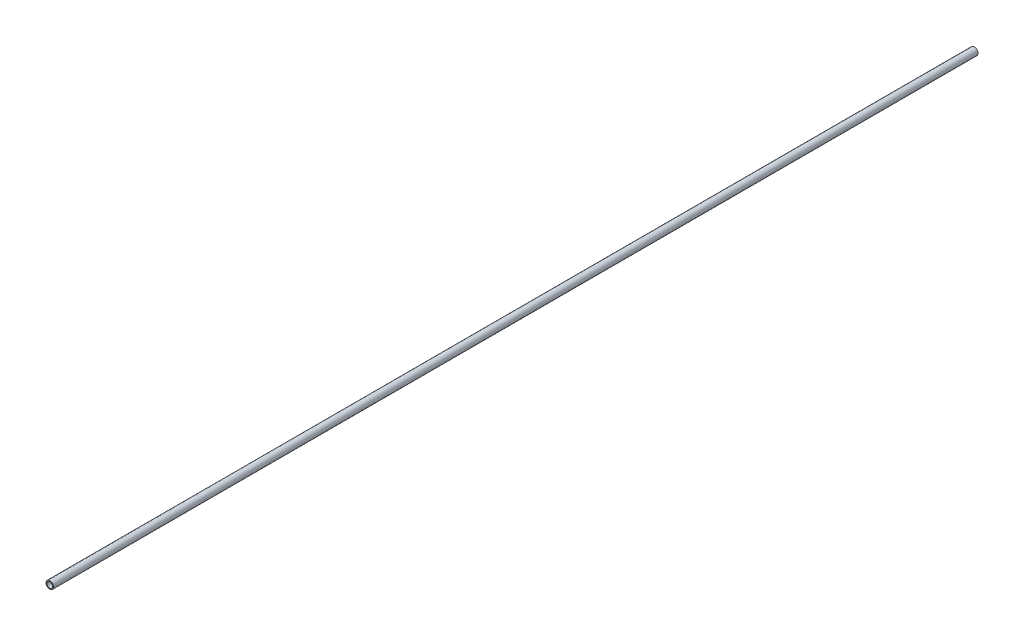
ISO-10303-21;
HEADER;
FILE_DESCRIPTION(('STEP AP214'),'2;1');
FILE_NAME('part.step','',(''),(''),'','','');
FILE_SCHEMA(('AUTOMOTIVE_DESIGN { 1 0 10303 214 1 1 1 1 }'));
ENDSEC;
DATA;
#1=APPLICATION_CONTEXT('core data for automotive mechanical design processes');
#2=APPLICATION_PROTOCOL_DEFINITION('international standard','automotive_design',2000,#1);
#3=PRODUCT_CONTEXT('',#1,'mechanical');
#4=PRODUCT('Part','Part','',(#3));
#5=PRODUCT_RELATED_PRODUCT_CATEGORY('part','',(#4));
#6=PRODUCT_DEFINITION_FORMATION('','',#4);
#7=PRODUCT_DEFINITION_CONTEXT('part definition',#1,'design');
#8=PRODUCT_DEFINITION('design','',#6,#7);
#9=PRODUCT_DEFINITION_SHAPE('','',#8);
#10=(LENGTH_UNIT() NAMED_UNIT(*) SI_UNIT(.MILLI.,.METRE.));
#11=(NAMED_UNIT(*) PLANE_ANGLE_UNIT() SI_UNIT($,.RADIAN.));
#12=(NAMED_UNIT(*) SI_UNIT($,.STERADIAN.) SOLID_ANGLE_UNIT());
#13=UNCERTAINTY_MEASURE_WITH_UNIT(LENGTH_MEASURE(1.E-05),#10,'distance_accuracy_value','');
#14=(GEOMETRIC_REPRESENTATION_CONTEXT(3) GLOBAL_UNCERTAINTY_ASSIGNED_CONTEXT((#13)) GLOBAL_UNIT_ASSIGNED_CONTEXT((#10,
#11,#12)) REPRESENTATION_CONTEXT('',''));
#15=CARTESIAN_POINT('',(0.,0.,0.));
#16=DIRECTION('',(0.,0.,1.));
#17=DIRECTION('',(1.,0.,0.));
#18=AXIS2_PLACEMENT_3D('',#15,#16,#17);
#19=CARTESIAN_POINT('',(0.,0.,990.6));
#20=DIRECTION('',(0.,0.,1.));
#21=DIRECTION('',(1.,0.,0.));
#22=AXIS2_PLACEMENT_3D('',#19,#20,#21);
#23=PLANE('',#22);
#24=CARTESIAN_POINT('',(0.,0.,990.6));
#25=DIRECTION('',(0.,0.,1.));
#26=DIRECTION('',(1.,0.,0.));
#27=AXIS2_PLACEMENT_3D('',#24,#25,#26);
#28=CIRCLE('',#27,4.);
#29=CARTESIAN_POINT('',(-4.,0.,990.6));
#30=VERTEX_POINT('',#29);
#31=EDGE_CURVE('E10',#30,#30,#28,.T.);
#32=ORIENTED_EDGE('',*,*,#31,.T.);
#33=EDGE_LOOP('',(#32));
#34=FACE_BOUND('',#33,.T.);
#35=CARTESIAN_POINT('',(0.,0.,990.6));
#36=DIRECTION('',(0.,0.,1.));
#37=DIRECTION('',(1.,0.,0.));
#38=AXIS2_PLACEMENT_3D('',#35,#36,#37);
#39=CIRCLE('',#38,3.);
#40=CARTESIAN_POINT('',(-3.,0.,990.6));
#41=VERTEX_POINT('',#40);
#42=EDGE_CURVE('E52',#41,#41,#39,.T.);
#43=ORIENTED_EDGE('',*,*,#42,.F.);
#44=EDGE_LOOP('',(#43));
#45=FACE_BOUND('',#44,.T.);
#46=ADVANCED_FACE('F39',(#34,#45),#23,.T.);
#47=CARTESIAN_POINT('',(0.,0.,0.));
#48=DIRECTION('',(0.,0.,1.));
#49=DIRECTION('',(1.,0.,0.));
#50=AXIS2_PLACEMENT_3D('',#47,#48,#49);
#51=PLANE('',#50);
#52=CARTESIAN_POINT('',(0.,0.,0.));
#53=DIRECTION('',(0.,0.,1.));
#54=DIRECTION('',(1.,0.,0.));
#55=AXIS2_PLACEMENT_3D('',#52,#53,#54);
#56=CIRCLE('',#55,4.);
#57=CARTESIAN_POINT('',(-4.,0.,0.));
#58=VERTEX_POINT('',#57);
#59=EDGE_CURVE('E43',#58,#58,#56,.T.);
#60=ORIENTED_EDGE('',*,*,#59,.F.);
#61=EDGE_LOOP('',(#60));
#62=FACE_BOUND('',#61,.T.);
#63=CARTESIAN_POINT('',(0.,0.,0.));
#64=DIRECTION('',(0.,0.,1.));
#65=DIRECTION('',(1.,0.,0.));
#66=AXIS2_PLACEMENT_3D('',#63,#64,#65);
#67=CIRCLE('',#66,3.);
#68=CARTESIAN_POINT('',(-3.,0.,0.));
#69=VERTEX_POINT('',#68);
#70=EDGE_CURVE('E54',#69,#69,#67,.T.);
#71=ORIENTED_EDGE('',*,*,#70,.T.);
#72=EDGE_LOOP('',(#71));
#73=FACE_BOUND('',#72,.T.);
#74=ADVANCED_FACE('F66',(#62,#73),#51,.F.);
#75=CARTESIAN_POINT('',(0.,0.,990.6));
#76=DIRECTION('',(0.,0.,-1.));
#77=DIRECTION('',(-1.,0.,0.));
#78=AXIS2_PLACEMENT_3D('',#75,#76,#77);
#79=CYLINDRICAL_SURFACE('',#78,4.);
#80=CARTESIAN_POINT('',(-4.,0.,990.6));
#81=CARTESIAN_POINT('',(-4.,0.,980.28125));
#82=CARTESIAN_POINT('',(-4.,0.,969.9625));
#83=CARTESIAN_POINT('',(-4.,0.,949.325));
#84=CARTESIAN_POINT('',(-4.,0.,939.00625));
#85=CARTESIAN_POINT('',(-4.,0.,918.36875));
#86=CARTESIAN_POINT('',(-4.,0.,908.05));
#87=CARTESIAN_POINT('',(-4.,0.,887.4125));
#88=CARTESIAN_POINT('',(-4.,0.,877.09375));
#89=CARTESIAN_POINT('',(-4.,0.,856.45625));
#90=CARTESIAN_POINT('',(-4.,0.,846.1375));
#91=CARTESIAN_POINT('',(-4.,0.,825.5));
#92=CARTESIAN_POINT('',(-4.,0.,815.18125));
#93=CARTESIAN_POINT('',(-4.,0.,794.54375));
#94=CARTESIAN_POINT('',(-4.,0.,784.225));
#95=CARTESIAN_POINT('',(-4.,0.,763.5875));
#96=CARTESIAN_POINT('',(-4.,0.,753.26875));
#97=CARTESIAN_POINT('',(-4.,0.,732.63125));
#98=CARTESIAN_POINT('',(-4.,0.,722.3125));
#99=CARTESIAN_POINT('',(-4.,0.,701.675));
#100=CARTESIAN_POINT('',(-4.,0.,691.35625));
#101=CARTESIAN_POINT('',(-4.,0.,670.71875));
#102=CARTESIAN_POINT('',(-4.,0.,660.4));
#103=CARTESIAN_POINT('',(-4.,0.,639.7625));
#104=CARTESIAN_POINT('',(-4.,0.,629.44375));
#105=CARTESIAN_POINT('',(-4.,0.,608.80625));
#106=CARTESIAN_POINT('',(-4.,0.,598.4875));
#107=CARTESIAN_POINT('',(-4.,0.,577.85));
#108=CARTESIAN_POINT('',(-4.,0.,567.53125));
#109=CARTESIAN_POINT('',(-4.,0.,546.89375));
#110=CARTESIAN_POINT('',(-4.,0.,536.575));
#111=CARTESIAN_POINT('',(-4.,0.,515.9375));
#112=CARTESIAN_POINT('',(-4.,0.,505.61875));
#113=CARTESIAN_POINT('',(-4.,0.,484.98125));
#114=CARTESIAN_POINT('',(-4.,0.,474.6625));
#115=CARTESIAN_POINT('',(-4.,0.,454.025));
#116=CARTESIAN_POINT('',(-4.,0.,443.70625));
#117=CARTESIAN_POINT('',(-4.,0.,423.06875));
#118=CARTESIAN_POINT('',(-4.,0.,412.75));
#119=CARTESIAN_POINT('',(-4.,0.,392.1125));
#120=CARTESIAN_POINT('',(-4.,0.,381.79375));
#121=CARTESIAN_POINT('',(-4.,0.,361.15625));
#122=CARTESIAN_POINT('',(-4.,0.,350.8375));
#123=CARTESIAN_POINT('',(-4.,0.,330.2));
#124=CARTESIAN_POINT('',(-4.,0.,319.88125));
#125=CARTESIAN_POINT('',(-4.,0.,299.24375));
#126=CARTESIAN_POINT('',(-4.,0.,288.925));
#127=CARTESIAN_POINT('',(-4.,0.,268.2875));
#128=CARTESIAN_POINT('',(-4.,0.,257.96875));
#129=CARTESIAN_POINT('',(-4.,0.,237.33125));
#130=CARTESIAN_POINT('',(-4.,0.,227.0125));
#131=CARTESIAN_POINT('',(-4.,0.,206.375));
#132=CARTESIAN_POINT('',(-4.,0.,196.05625));
#133=CARTESIAN_POINT('',(-4.,0.,175.41875));
#134=CARTESIAN_POINT('',(-4.,0.,165.1));
#135=CARTESIAN_POINT('',(-4.,0.,144.4625));
#136=CARTESIAN_POINT('',(-4.,0.,134.14375));
#137=CARTESIAN_POINT('',(-4.,0.,113.50625));
#138=CARTESIAN_POINT('',(-4.,0.,103.1875));
#139=CARTESIAN_POINT('',(-4.,0.,82.5500000000001));
#140=CARTESIAN_POINT('',(-4.,0.,72.23125));
#141=CARTESIAN_POINT('',(-4.,0.,51.59375));
#142=CARTESIAN_POINT('',(-4.,0.,41.275));
#143=CARTESIAN_POINT('',(-4.,0.,20.6375));
#144=CARTESIAN_POINT('',(-4.,0.,10.31875));
#145=CARTESIAN_POINT('',(-4.,0.,0.));
#146=B_SPLINE_CURVE_WITH_KNOTS('',3,(#80,#81,#82,#83,#84,#85,#86,#87,#88,#89,#90,#91,#92,#93,
#94,#95,#96,#97,#98,#99,#100,#101,#102,#103,#104,#105,#106,#107,#108,#109,#110,#111,#112,#113,
#114,#115,#116,#117,#118,#119,#120,#121,#122,#123,#124,#125,#126,#127,#128,#129,#130,#131,#132,
#133,#134,#135,#136,#137,#138,#139,#140,#141,#142,#143,#144,#145),.UNSPECIFIED.,.F.,.F.,(4,2,2,
2,2,2,2,2,2,2,2,2,2,2,2,2,2,2,2,2,2,2,2,2,2,2,2,2,2,2,2,2,4),(0.,30.95625,61.9125,
92.8687500000001,123.825,154.78125,185.7375,216.69375,247.65,278.60625,309.5625,340.51875,
371.475,402.43125,433.3875,464.34375,495.3,526.25625,557.2125,588.16875,619.125,650.08125,
681.0375,711.99375,742.95,773.90625,804.8625,835.81875,866.775,897.73125,928.6875,959.64375,
990.6),.UNSPECIFIED.);
#147=EDGE_CURVE('BSEAM41',#30,#58,#146,.T.);
#148=ORIENTED_EDGE('',*,*,#31,.F.);
#149=ORIENTED_EDGE('',*,*,#59,.T.);
#150=ORIENTED_EDGE('',*,*,#147,.T.);
#151=ORIENTED_EDGE('',*,*,#147,.F.);
#152=EDGE_LOOP('',(#148,#150,#149,#151));
#153=FACE_BOUND('',#152,.T.);
#154=ADVANCED_FACE('F41',(#153),#79,.T.);
#155=CARTESIAN_POINT('',(0.,0.,990.6));
#156=DIRECTION('',(0.,0.,-1.));
#157=DIRECTION('',(-1.,0.,0.));
#158=AXIS2_PLACEMENT_3D('',#155,#156,#157);
#159=CYLINDRICAL_SURFACE('',#158,3.);
#160=CARTESIAN_POINT('',(-3.,0.,990.6));
#161=CARTESIAN_POINT('',(-3.,0.,980.28125));
#162=CARTESIAN_POINT('',(-3.,0.,969.9625));
#163=CARTESIAN_POINT('',(-3.,0.,949.325));
#164=CARTESIAN_POINT('',(-3.,0.,939.00625));
#165=CARTESIAN_POINT('',(-3.,0.,918.36875));
#166=CARTESIAN_POINT('',(-3.,0.,908.05));
#167=CARTESIAN_POINT('',(-3.,0.,887.4125));
#168=CARTESIAN_POINT('',(-3.,0.,877.09375));
#169=CARTESIAN_POINT('',(-3.,0.,856.45625));
#170=CARTESIAN_POINT('',(-3.,0.,846.1375));
#171=CARTESIAN_POINT('',(-3.,0.,825.5));
#172=CARTESIAN_POINT('',(-3.,0.,815.18125));
#173=CARTESIAN_POINT('',(-3.,0.,794.54375));
#174=CARTESIAN_POINT('',(-3.,0.,784.225));
#175=CARTESIAN_POINT('',(-3.,0.,763.5875));
#176=CARTESIAN_POINT('',(-3.,0.,753.26875));
#177=CARTESIAN_POINT('',(-3.,0.,732.63125));
#178=CARTESIAN_POINT('',(-3.,0.,722.3125));
#179=CARTESIAN_POINT('',(-3.,0.,701.675));
#180=CARTESIAN_POINT('',(-3.,0.,691.35625));
#181=CARTESIAN_POINT('',(-3.,0.,670.71875));
#182=CARTESIAN_POINT('',(-3.,0.,660.4));
#183=CARTESIAN_POINT('',(-3.,0.,639.7625));
#184=CARTESIAN_POINT('',(-3.,0.,629.44375));
#185=CARTESIAN_POINT('',(-3.,0.,608.80625));
#186=CARTESIAN_POINT('',(-3.,0.,598.4875));
#187=CARTESIAN_POINT('',(-3.,0.,577.85));
#188=CARTESIAN_POINT('',(-3.,0.,567.53125));
#189=CARTESIAN_POINT('',(-3.,0.,546.89375));
#190=CARTESIAN_POINT('',(-3.,0.,536.575));
#191=CARTESIAN_POINT('',(-3.,0.,515.9375));
#192=CARTESIAN_POINT('',(-3.,0.,505.61875));
#193=CARTESIAN_POINT('',(-3.,0.,484.98125));
#194=CARTESIAN_POINT('',(-3.,0.,474.6625));
#195=CARTESIAN_POINT('',(-3.,0.,454.025));
#196=CARTESIAN_POINT('',(-3.,0.,443.70625));
#197=CARTESIAN_POINT('',(-3.,0.,423.06875));
#198=CARTESIAN_POINT('',(-3.,0.,412.75));
#199=CARTESIAN_POINT('',(-3.,0.,392.1125));
#200=CARTESIAN_POINT('',(-3.,0.,381.79375));
#201=CARTESIAN_POINT('',(-3.,0.,361.15625));
#202=CARTESIAN_POINT('',(-3.,0.,350.8375));
#203=CARTESIAN_POINT('',(-3.,0.,330.2));
#204=CARTESIAN_POINT('',(-3.,0.,319.88125));
#205=CARTESIAN_POINT('',(-3.,0.,299.24375));
#206=CARTESIAN_POINT('',(-3.,0.,288.925));
#207=CARTESIAN_POINT('',(-3.,0.,268.2875));
#208=CARTESIAN_POINT('',(-3.,0.,257.96875));
#209=CARTESIAN_POINT('',(-3.,0.,237.33125));
#210=CARTESIAN_POINT('',(-3.,0.,227.0125));
#211=CARTESIAN_POINT('',(-3.,0.,206.375));
#212=CARTESIAN_POINT('',(-3.,0.,196.05625));
#213=CARTESIAN_POINT('',(-3.,0.,175.41875));
#214=CARTESIAN_POINT('',(-3.,0.,165.1));
#215=CARTESIAN_POINT('',(-3.,0.,144.4625));
#216=CARTESIAN_POINT('',(-3.,0.,134.14375));
#217=CARTESIAN_POINT('',(-3.,0.,113.50625));
#218=CARTESIAN_POINT('',(-3.,0.,103.1875));
#219=CARTESIAN_POINT('',(-3.,0.,82.5500000000001));
#220=CARTESIAN_POINT('',(-3.,0.,72.23125));
#221=CARTESIAN_POINT('',(-3.,0.,51.59375));
#222=CARTESIAN_POINT('',(-3.,0.,41.275));
#223=CARTESIAN_POINT('',(-3.,0.,20.6375));
#224=CARTESIAN_POINT('',(-3.,0.,10.31875));
#225=CARTESIAN_POINT('',(-3.,0.,0.));
#226=B_SPLINE_CURVE_WITH_KNOTS('',3,(#160,#161,#162,#163,#164,#165,#166,#167,#168,#169,#170,
#171,#172,#173,#174,#175,#176,#177,#178,#179,#180,#181,#182,#183,#184,#185,#186,#187,#188,#189,
#190,#191,#192,#193,#194,#195,#196,#197,#198,#199,#200,#201,#202,#203,#204,#205,#206,#207,#208,
#209,#210,#211,#212,#213,#214,#215,#216,#217,#218,#219,#220,#221,#222,#223,#224,#225),
.UNSPECIFIED.,.F.,.F.,(4,2,2,2,2,2,2,2,2,2,2,2,2,2,2,2,2,2,2,2,2,2,2,2,2,2,2,2,2,2,2,2,4),(0.,
30.95625,61.9125,92.8687500000001,123.825,154.78125,185.7375,216.69375,247.65,278.60625,
309.5625,340.51875,371.475,402.43125,433.3875,464.34375,495.3,526.25625,557.2125,588.16875,
619.125,650.08125,681.0375,711.99375,742.95,773.90625,804.8625,835.81875,866.775,897.73125,
928.6875,959.64375,990.6),.UNSPECIFIED.);
#227=EDGE_CURVE('BSEAM62',#41,#69,#226,.T.);
#228=ORIENTED_EDGE('',*,*,#42,.T.);
#229=ORIENTED_EDGE('',*,*,#70,.F.);
#230=ORIENTED_EDGE('',*,*,#227,.T.);
#231=ORIENTED_EDGE('',*,*,#227,.F.);
#232=EDGE_LOOP('',(#228,#230,#229,#231));
#233=FACE_BOUND('',#232,.T.);
#234=ADVANCED_FACE('F62',(#233),#159,.F.);
#235=CLOSED_SHELL('',(#46,#74,#154,#234));
#236=MANIFOLD_SOLID_BREP('B2',#235);
#237=ADVANCED_BREP_SHAPE_REPRESENTATION('',(#18,#236),#14);
#238=SHAPE_DEFINITION_REPRESENTATION(#9,#237);
ENDSEC;
END-ISO-10303-21;
